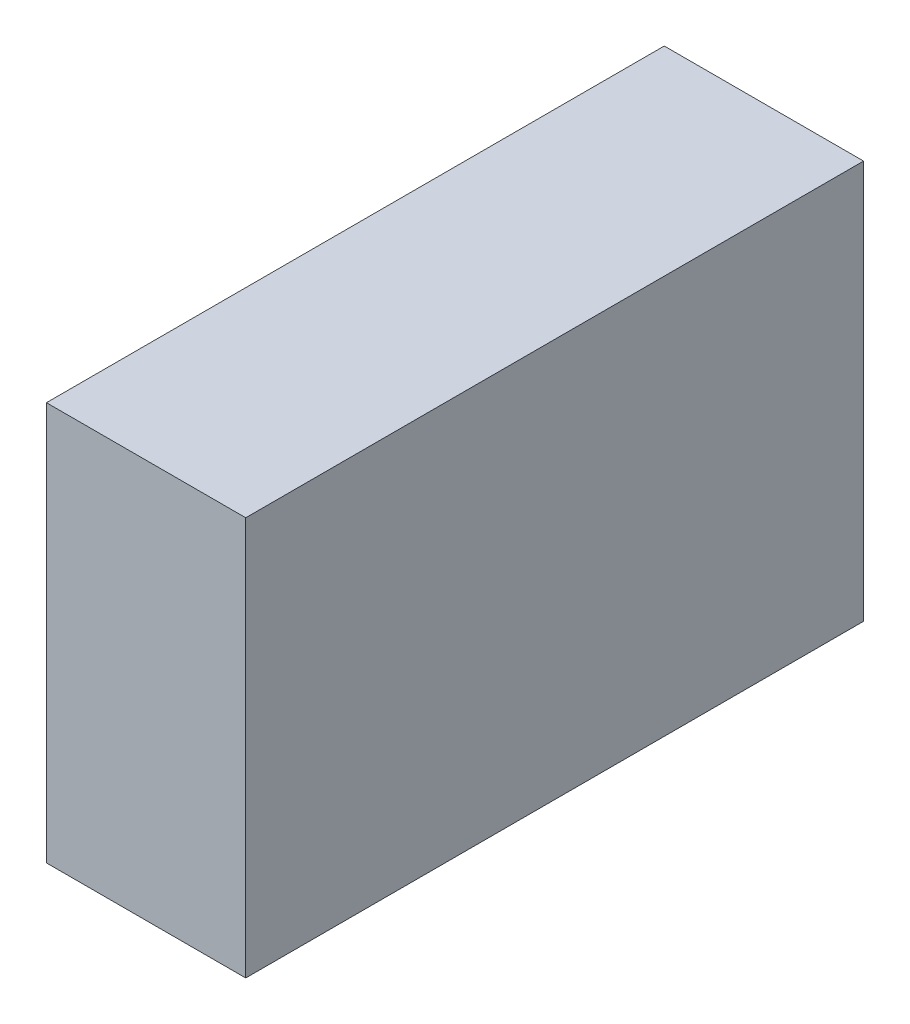
ISO-10303-21;
HEADER;
FILE_DESCRIPTION(('STEP AP214'),'2;1');
FILE_NAME('part.step','',(''),(''),'','','');
FILE_SCHEMA(('AUTOMOTIVE_DESIGN { 1 0 10303 214 1 1 1 1 }'));
ENDSEC;
DATA;
#1=APPLICATION_CONTEXT('core data for automotive mechanical design processes');
#2=APPLICATION_PROTOCOL_DEFINITION('international standard','automotive_design',2000,#1);
#3=PRODUCT_CONTEXT('',#1,'mechanical');
#4=PRODUCT('Part','Part','',(#3));
#5=PRODUCT_RELATED_PRODUCT_CATEGORY('part','',(#4));
#6=PRODUCT_DEFINITION_FORMATION('','',#4);
#7=PRODUCT_DEFINITION_CONTEXT('part definition',#1,'design');
#8=PRODUCT_DEFINITION('design','',#6,#7);
#9=PRODUCT_DEFINITION_SHAPE('','',#8);
#10=(LENGTH_UNIT() NAMED_UNIT(*) SI_UNIT(.MILLI.,.METRE.));
#11=(NAMED_UNIT(*) PLANE_ANGLE_UNIT() SI_UNIT($,.RADIAN.));
#12=(NAMED_UNIT(*) SI_UNIT($,.STERADIAN.) SOLID_ANGLE_UNIT());
#13=UNCERTAINTY_MEASURE_WITH_UNIT(LENGTH_MEASURE(1.E-05),#10,'distance_accuracy_value','');
#14=(GEOMETRIC_REPRESENTATION_CONTEXT(3) GLOBAL_UNCERTAINTY_ASSIGNED_CONTEXT((#13)) GLOBAL_UNIT_ASSIGNED_CONTEXT((#10,
#11,#12)) REPRESENTATION_CONTEXT('',''));
#15=CARTESIAN_POINT('',(0.,0.,0.));
#16=DIRECTION('',(0.,0.,1.));
#17=DIRECTION('',(1.,0.,0.));
#18=AXIS2_PLACEMENT_3D('',#15,#16,#17);
#19=CARTESIAN_POINT('',(10.,0.,0.));
#20=DIRECTION('',(0.,0.,-1.));
#21=DIRECTION('',(-1.,0.,0.));
#22=AXIS2_PLACEMENT_3D('',#19,#20,#21);
#23=PLANE('',#22);
#24=DIRECTION('',(0.,-1.,0.));
#25=VECTOR('',#24,1.);
#26=CARTESIAN_POINT('',(0.,0.,0.));
#27=LINE('',#26,#25);
#28=CARTESIAN_POINT('',(0.,20.,0.));
#29=VERTEX_POINT('',#28);
#30=CARTESIAN_POINT('',(0.,0.,0.));
#31=VERTEX_POINT('',#30);
#32=EDGE_CURVE('E105',#29,#31,#27,.T.);
#33=ORIENTED_EDGE('',*,*,#32,.T.);
#34=DIRECTION('',(-1.,0.,0.));
#35=VECTOR('',#34,1.);
#36=CARTESIAN_POINT('',(10.,0.,0.));
#37=LINE('',#36,#35);
#38=CARTESIAN_POINT('',(10.,0.,0.));
#39=VERTEX_POINT('',#38);
#40=EDGE_CURVE('E11',#39,#31,#37,.T.);
#41=ORIENTED_EDGE('',*,*,#40,.F.);
#42=DIRECTION('',(0.,-1.,0.));
#43=VECTOR('',#42,1.);
#44=CARTESIAN_POINT('',(10.,0.,0.));
#45=LINE('',#44,#43);
#46=CARTESIAN_POINT('',(10.,20.,0.));
#47=VERTEX_POINT('',#46);
#48=EDGE_CURVE('E89',#47,#39,#45,.T.);
#49=ORIENTED_EDGE('',*,*,#48,.F.);
#50=DIRECTION('',(-1.,0.,0.));
#51=VECTOR('',#50,1.);
#52=CARTESIAN_POINT('',(10.,20.,0.));
#53=LINE('',#52,#51);
#54=EDGE_CURVE('E97',#47,#29,#53,.T.);
#55=ORIENTED_EDGE('',*,*,#54,.T.);
#56=EDGE_LOOP('',(#33,#41,#49,#55));
#57=FACE_BOUND('',#56,.T.);
#58=ADVANCED_FACE('F39',(#57),#23,.F.);
#59=CARTESIAN_POINT('',(10.,0.,0.));
#60=DIRECTION('',(0.,1.,0.));
#61=DIRECTION('',(0.,0.,1.));
#62=AXIS2_PLACEMENT_3D('',#59,#60,#61);
#63=PLANE('',#62);
#64=DIRECTION('',(0.,0.,-1.));
#65=VECTOR('',#64,1.);
#66=CARTESIAN_POINT('',(0.,0.,0.));
#67=LINE('',#66,#65);
#68=CARTESIAN_POINT('',(0.,0.,-31.));
#69=VERTEX_POINT('',#68);
#70=EDGE_CURVE('E92',#31,#69,#67,.T.);
#71=ORIENTED_EDGE('',*,*,#70,.T.);
#72=DIRECTION('',(-1.,0.,0.));
#73=VECTOR('',#72,1.);
#74=CARTESIAN_POINT('',(10.,0.,-31.));
#75=LINE('',#74,#73);
#76=CARTESIAN_POINT('',(10.,0.,-31.));
#77=VERTEX_POINT('',#76);
#78=EDGE_CURVE('E50',#77,#69,#75,.T.);
#79=ORIENTED_EDGE('',*,*,#78,.F.);
#80=DIRECTION('',(0.,0.,-1.));
#81=VECTOR('',#80,1.);
#82=CARTESIAN_POINT('',(10.,0.,0.));
#83=LINE('',#82,#81);
#84=EDGE_CURVE('E82',#39,#77,#83,.T.);
#85=ORIENTED_EDGE('',*,*,#84,.F.);
#86=ORIENTED_EDGE('',*,*,#40,.T.);
#87=EDGE_LOOP('',(#71,#79,#85,#86));
#88=FACE_BOUND('',#87,.T.);
#89=ADVANCED_FACE('F93',(#88),#63,.F.);
#90=CARTESIAN_POINT('',(10.,0.,-31.));
#91=DIRECTION('',(0.,0.,1.));
#92=DIRECTION('',(1.,0.,0.));
#93=AXIS2_PLACEMENT_3D('',#90,#91,#92);
#94=PLANE('',#93);
#95=DIRECTION('',(0.,1.,0.));
#96=VECTOR('',#95,1.);
#97=CARTESIAN_POINT('',(0.,0.,-31.));
#98=LINE('',#97,#96);
#99=CARTESIAN_POINT('',(0.,20.,-31.));
#100=VERTEX_POINT('',#99);
#101=EDGE_CURVE('E72',#69,#100,#98,.T.);
#102=ORIENTED_EDGE('',*,*,#101,.T.);
#103=DIRECTION('',(-1.,0.,0.));
#104=VECTOR('',#103,1.);
#105=CARTESIAN_POINT('',(10.,20.,-31.));
#106=LINE('',#105,#104);
#107=CARTESIAN_POINT('',(10.,20.,-31.));
#108=VERTEX_POINT('',#107);
#109=EDGE_CURVE('E94',#108,#100,#106,.T.);
#110=ORIENTED_EDGE('',*,*,#109,.F.);
#111=DIRECTION('',(0.,1.,0.));
#112=VECTOR('',#111,1.);
#113=CARTESIAN_POINT('',(10.,0.,-31.));
#114=LINE('',#113,#112);
#115=EDGE_CURVE('E88',#77,#108,#114,.T.);
#116=ORIENTED_EDGE('',*,*,#115,.F.);
#117=ORIENTED_EDGE('',*,*,#78,.T.);
#118=EDGE_LOOP('',(#102,#110,#116,#117));
#119=FACE_BOUND('',#118,.T.);
#120=ADVANCED_FACE('F96',(#119),#94,.F.);
#121=CARTESIAN_POINT('',(10.,20.,0.));
#122=DIRECTION('',(0.,-1.,0.));
#123=DIRECTION('',(0.,0.,-1.));
#124=AXIS2_PLACEMENT_3D('',#121,#122,#123);
#125=PLANE('',#124);
#126=DIRECTION('',(0.,0.,1.));
#127=VECTOR('',#126,1.);
#128=CARTESIAN_POINT('',(0.,20.,0.));
#129=LINE('',#128,#127);
#130=EDGE_CURVE('E76',#100,#29,#129,.T.);
#131=ORIENTED_EDGE('',*,*,#130,.T.);
#132=ORIENTED_EDGE('',*,*,#54,.F.);
#133=DIRECTION('',(0.,0.,1.));
#134=VECTOR('',#133,1.);
#135=CARTESIAN_POINT('',(10.,20.,0.));
#136=LINE('',#135,#134);
#137=EDGE_CURVE('E54',#108,#47,#136,.T.);
#138=ORIENTED_EDGE('',*,*,#137,.F.);
#139=ORIENTED_EDGE('',*,*,#109,.T.);
#140=EDGE_LOOP('',(#131,#132,#138,#139));
#141=FACE_BOUND('',#140,.T.);
#142=ADVANCED_FACE('F108',(#141),#125,.F.);
#143=CARTESIAN_POINT('',(10.,0.,0.));
#144=DIRECTION('',(-1.,0.,0.));
#145=DIRECTION('',(0.,0.,1.));
#146=AXIS2_PLACEMENT_3D('',#143,#144,#145);
#147=PLANE('',#146);
#148=ORIENTED_EDGE('',*,*,#48,.T.);
#149=ORIENTED_EDGE('',*,*,#84,.T.);
#150=ORIENTED_EDGE('',*,*,#115,.T.);
#151=ORIENTED_EDGE('',*,*,#137,.T.);
#152=EDGE_LOOP('',(#148,#149,#150,#151));
#153=FACE_BOUND('',#152,.T.);
#154=ADVANCED_FACE('F86',(#153),#147,.F.);
#155=CARTESIAN_POINT('',(0.,0.,0.));
#156=DIRECTION('',(-1.,0.,0.));
#157=DIRECTION('',(0.,0.,1.));
#158=AXIS2_PLACEMENT_3D('',#155,#156,#157);
#159=PLANE('',#158);
#160=ORIENTED_EDGE('',*,*,#32,.F.);
#161=ORIENTED_EDGE('',*,*,#130,.F.);
#162=ORIENTED_EDGE('',*,*,#101,.F.);
#163=ORIENTED_EDGE('',*,*,#70,.F.);
#164=EDGE_LOOP('',(#160,#161,#162,#163));
#165=FACE_BOUND('',#164,.T.);
#166=ADVANCED_FACE('F115',(#165),#159,.T.);
#167=CLOSED_SHELL('',(#58,#89,#120,#142,#154,#166));
#168=MANIFOLD_SOLID_BREP('B2',#167);
#169=ADVANCED_BREP_SHAPE_REPRESENTATION('',(#18,#168),#14);
#170=SHAPE_DEFINITION_REPRESENTATION(#9,#169);
ENDSEC;
END-ISO-10303-21;
